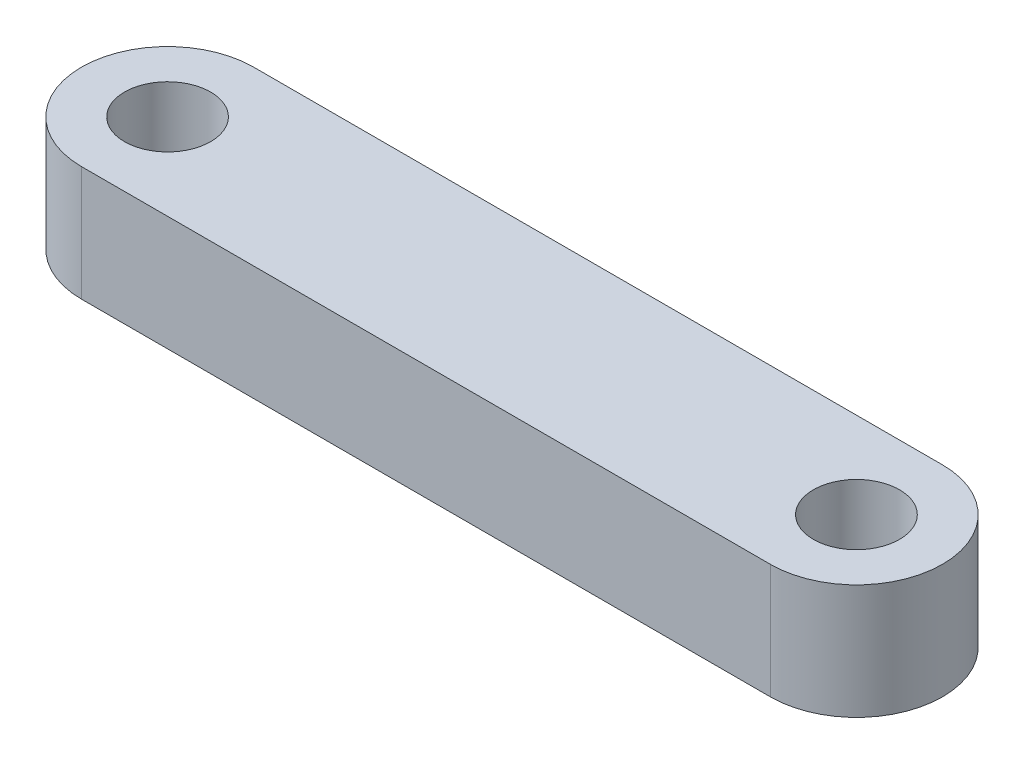
ISO-10303-21;
HEADER;
FILE_DESCRIPTION(('STEP AP214'),'2;1');
FILE_NAME('part.step','',(''),(''),'','','');
FILE_SCHEMA(('AUTOMOTIVE_DESIGN { 1 0 10303 214 1 1 1 1 }'));
ENDSEC;
DATA;
#1=APPLICATION_CONTEXT('core data for automotive mechanical design processes');
#2=APPLICATION_PROTOCOL_DEFINITION('international standard','automotive_design',2000,#1);
#3=PRODUCT_CONTEXT('',#1,'mechanical');
#4=PRODUCT('Part','Part','',(#3));
#5=PRODUCT_RELATED_PRODUCT_CATEGORY('part','',(#4));
#6=PRODUCT_DEFINITION_FORMATION('','',#4);
#7=PRODUCT_DEFINITION_CONTEXT('part definition',#1,'design');
#8=PRODUCT_DEFINITION('design','',#6,#7);
#9=PRODUCT_DEFINITION_SHAPE('','',#8);
#10=(LENGTH_UNIT() NAMED_UNIT(*) SI_UNIT(.MILLI.,.METRE.));
#11=(NAMED_UNIT(*) PLANE_ANGLE_UNIT() SI_UNIT($,.RADIAN.));
#12=(NAMED_UNIT(*) SI_UNIT($,.STERADIAN.) SOLID_ANGLE_UNIT());
#13=UNCERTAINTY_MEASURE_WITH_UNIT(LENGTH_MEASURE(1.E-05),#10,'distance_accuracy_value','');
#14=(GEOMETRIC_REPRESENTATION_CONTEXT(3) GLOBAL_UNCERTAINTY_ASSIGNED_CONTEXT((#13)) GLOBAL_UNIT_ASSIGNED_CONTEXT((#10,
#11,#12)) REPRESENTATION_CONTEXT('',''));
#15=CARTESIAN_POINT('',(0.,0.,0.));
#16=DIRECTION('',(0.,0.,1.));
#17=DIRECTION('',(1.,0.,0.));
#18=AXIS2_PLACEMENT_3D('',#15,#16,#17);
#19=CARTESIAN_POINT('',(0.,4.,0.));
#20=DIRECTION('',(0.,1.,0.));
#21=DIRECTION('',(0.,0.,1.));
#22=AXIS2_PLACEMENT_3D('',#19,#20,#21);
#23=PLANE('',#22);
#24=CARTESIAN_POINT('',(0.,4.,0.));
#25=DIRECTION('',(0.,1.,0.));
#26=DIRECTION('',(0.,0.,1.));
#27=AXIS2_PLACEMENT_3D('',#24,#25,#26);
#28=CIRCLE('',#27,1.5);
#29=CARTESIAN_POINT('',(0.,4.,1.5));
#30=VERTEX_POINT('',#29);
#31=EDGE_CURVE('E108',#30,#30,#28,.T.);
#32=ORIENTED_EDGE('',*,*,#31,.F.);
#33=EDGE_LOOP('',(#32));
#34=FACE_BOUND('',#33,.T.);
#35=CARTESIAN_POINT('',(0.,4.,0.));
#36=DIRECTION('',(0.,1.,0.));
#37=DIRECTION('',(0.,0.,1.));
#38=AXIS2_PLACEMENT_3D('',#35,#36,#37);
#39=CIRCLE('',#38,3.);
#40=CARTESIAN_POINT('',(0.,4.,-3.));
#41=VERTEX_POINT('',#40);
#42=CARTESIAN_POINT('',(0.,4.,3.));
#43=VERTEX_POINT('',#42);
#44=EDGE_CURVE('E93',#41,#43,#39,.T.);
#45=ORIENTED_EDGE('',*,*,#44,.T.);
#46=DIRECTION('',(1.,0.,0.));
#47=VECTOR('',#46,1.);
#48=CARTESIAN_POINT('',(0.,4.,3.));
#49=LINE('',#48,#47);
#50=CARTESIAN_POINT('',(24.,4.,3.));
#51=VERTEX_POINT('',#50);
#52=EDGE_CURVE('E88',#43,#51,#49,.T.);
#53=ORIENTED_EDGE('',*,*,#52,.T.);
#54=CARTESIAN_POINT('',(24.,4.,0.));
#55=DIRECTION('',(0.,1.,0.));
#56=DIRECTION('',(0.,0.,1.));
#57=AXIS2_PLACEMENT_3D('',#54,#55,#56);
#58=CIRCLE('',#57,3.);
#59=CARTESIAN_POINT('',(24.,4.,-3.));
#60=VERTEX_POINT('',#59);
#61=EDGE_CURVE('E91',#51,#60,#58,.T.);
#62=ORIENTED_EDGE('',*,*,#61,.T.);
#63=DIRECTION('',(-1.,0.,0.));
#64=VECTOR('',#63,1.);
#65=CARTESIAN_POINT('',(0.,4.,-3.));
#66=LINE('',#65,#64);
#67=EDGE_CURVE('E58',#60,#41,#66,.T.);
#68=ORIENTED_EDGE('',*,*,#67,.T.);
#69=EDGE_LOOP('',(#45,#53,#62,#68));
#70=FACE_BOUND('',#69,.T.);
#71=CARTESIAN_POINT('',(24.,4.,0.));
#72=DIRECTION('',(0.,1.,0.));
#73=DIRECTION('',(0.,0.,1.));
#74=AXIS2_PLACEMENT_3D('',#71,#72,#73);
#75=CIRCLE('',#74,1.5);
#76=CARTESIAN_POINT('',(24.,4.,1.5));
#77=VERTEX_POINT('',#76);
#78=EDGE_CURVE('E123',#77,#77,#75,.T.);
#79=ORIENTED_EDGE('',*,*,#78,.F.);
#80=EDGE_LOOP('',(#79));
#81=FACE_BOUND('',#80,.T.);
#82=ADVANCED_FACE('F41',(#34,#70,#81),#23,.T.);
#83=CARTESIAN_POINT('',(0.,0.,0.));
#84=DIRECTION('',(0.,1.,0.));
#85=DIRECTION('',(0.,0.,1.));
#86=AXIS2_PLACEMENT_3D('',#83,#84,#85);
#87=PLANE('',#86);
#88=CARTESIAN_POINT('',(0.,0.,0.));
#89=DIRECTION('',(0.,1.,0.));
#90=DIRECTION('',(0.,0.,1.));
#91=AXIS2_PLACEMENT_3D('',#88,#89,#90);
#92=CIRCLE('',#91,3.);
#93=CARTESIAN_POINT('',(0.,0.,-3.));
#94=VERTEX_POINT('',#93);
#95=CARTESIAN_POINT('',(0.,0.,3.));
#96=VERTEX_POINT('',#95);
#97=EDGE_CURVE('E105',#94,#96,#92,.T.);
#98=ORIENTED_EDGE('',*,*,#97,.F.);
#99=DIRECTION('',(-1.,0.,0.));
#100=VECTOR('',#99,1.);
#101=CARTESIAN_POINT('',(0.,0.,-3.));
#102=LINE('',#101,#100);
#103=CARTESIAN_POINT('',(24.,0.,-3.));
#104=VERTEX_POINT('',#103);
#105=EDGE_CURVE('E81',#104,#94,#102,.T.);
#106=ORIENTED_EDGE('',*,*,#105,.F.);
#107=CARTESIAN_POINT('',(24.,0.,0.));
#108=DIRECTION('',(0.,1.,0.));
#109=DIRECTION('',(0.,0.,1.));
#110=AXIS2_PLACEMENT_3D('',#107,#108,#109);
#111=CIRCLE('',#110,3.);
#112=CARTESIAN_POINT('',(24.,0.,3.));
#113=VERTEX_POINT('',#112);
#114=EDGE_CURVE('E75',#113,#104,#111,.T.);
#115=ORIENTED_EDGE('',*,*,#114,.F.);
#116=DIRECTION('',(1.,0.,0.));
#117=VECTOR('',#116,1.);
#118=CARTESIAN_POINT('',(0.,0.,3.));
#119=LINE('',#118,#117);
#120=EDGE_CURVE('E97',#96,#113,#119,.T.);
#121=ORIENTED_EDGE('',*,*,#120,.F.);
#122=EDGE_LOOP('',(#98,#106,#115,#121));
#123=FACE_BOUND('',#122,.T.);
#124=CARTESIAN_POINT('',(0.,0.,0.));
#125=DIRECTION('',(0.,1.,0.));
#126=DIRECTION('',(0.,0.,1.));
#127=AXIS2_PLACEMENT_3D('',#124,#125,#126);
#128=CIRCLE('',#127,1.5);
#129=CARTESIAN_POINT('',(0.,0.,1.5));
#130=VERTEX_POINT('',#129);
#131=EDGE_CURVE('E120',#130,#130,#128,.T.);
#132=ORIENTED_EDGE('',*,*,#131,.T.);
#133=EDGE_LOOP('',(#132));
#134=FACE_BOUND('',#133,.T.);
#135=CARTESIAN_POINT('',(24.,0.,0.));
#136=DIRECTION('',(0.,1.,0.));
#137=DIRECTION('',(0.,0.,1.));
#138=AXIS2_PLACEMENT_3D('',#135,#136,#137);
#139=CIRCLE('',#138,1.5);
#140=CARTESIAN_POINT('',(24.,0.,1.5));
#141=VERTEX_POINT('',#140);
#142=EDGE_CURVE('E126',#141,#141,#139,.T.);
#143=ORIENTED_EDGE('',*,*,#142,.T.);
#144=EDGE_LOOP('',(#143));
#145=FACE_BOUND('',#144,.T.);
#146=ADVANCED_FACE('F116',(#123,#134,#145),#87,.F.);
#147=CARTESIAN_POINT('',(0.,4.,0.));
#148=DIRECTION('',(0.,-1.,0.));
#149=DIRECTION('',(0.,0.,-1.));
#150=AXIS2_PLACEMENT_3D('',#147,#148,#149);
#151=CYLINDRICAL_SURFACE('',#150,3.);
#152=ORIENTED_EDGE('',*,*,#97,.T.);
#153=DIRECTION('',(0.,-1.,0.));
#154=VECTOR('',#153,1.);
#155=CARTESIAN_POINT('',(0.,4.,3.));
#156=LINE('',#155,#154);
#157=EDGE_CURVE('E11',#43,#96,#156,.T.);
#158=ORIENTED_EDGE('',*,*,#157,.F.);
#159=ORIENTED_EDGE('',*,*,#44,.F.);
#160=DIRECTION('',(0.,-1.,0.));
#161=VECTOR('',#160,1.);
#162=CARTESIAN_POINT('',(0.,4.,-3.));
#163=LINE('',#162,#161);
#164=EDGE_CURVE('E101',#41,#94,#163,.T.);
#165=ORIENTED_EDGE('',*,*,#164,.T.);
#166=EDGE_LOOP('',(#152,#158,#159,#165));
#167=FACE_BOUND('',#166,.T.);
#168=ADVANCED_FACE('F43',(#167),#151,.T.);
#169=CARTESIAN_POINT('',(0.,4.,3.));
#170=DIRECTION('',(0.,0.,-1.));
#171=DIRECTION('',(-1.,0.,0.));
#172=AXIS2_PLACEMENT_3D('',#169,#170,#171);
#173=PLANE('',#172);
#174=ORIENTED_EDGE('',*,*,#120,.T.);
#175=DIRECTION('',(0.,-1.,0.));
#176=VECTOR('',#175,1.);
#177=CARTESIAN_POINT('',(24.,4.,3.));
#178=LINE('',#177,#176);
#179=EDGE_CURVE('E50',#51,#113,#178,.T.);
#180=ORIENTED_EDGE('',*,*,#179,.F.);
#181=ORIENTED_EDGE('',*,*,#52,.F.);
#182=ORIENTED_EDGE('',*,*,#157,.T.);
#183=EDGE_LOOP('',(#174,#180,#181,#182));
#184=FACE_BOUND('',#183,.T.);
#185=ADVANCED_FACE('F96',(#184),#173,.F.);
#186=CARTESIAN_POINT('',(24.,4.,0.));
#187=DIRECTION('',(0.,-1.,0.));
#188=DIRECTION('',(0.,0.,-1.));
#189=AXIS2_PLACEMENT_3D('',#186,#187,#188);
#190=CYLINDRICAL_SURFACE('',#189,3.);
#191=ORIENTED_EDGE('',*,*,#114,.T.);
#192=DIRECTION('',(0.,-1.,0.));
#193=VECTOR('',#192,1.);
#194=CARTESIAN_POINT('',(24.,4.,-3.));
#195=LINE('',#194,#193);
#196=EDGE_CURVE('E98',#60,#104,#195,.T.);
#197=ORIENTED_EDGE('',*,*,#196,.F.);
#198=ORIENTED_EDGE('',*,*,#61,.F.);
#199=ORIENTED_EDGE('',*,*,#179,.T.);
#200=EDGE_LOOP('',(#191,#197,#198,#199));
#201=FACE_BOUND('',#200,.T.);
#202=ADVANCED_FACE('F99',(#201),#190,.T.);
#203=CARTESIAN_POINT('',(0.,4.,-3.));
#204=DIRECTION('',(0.,0.,1.));
#205=DIRECTION('',(1.,0.,0.));
#206=AXIS2_PLACEMENT_3D('',#203,#204,#205);
#207=PLANE('',#206);
#208=ORIENTED_EDGE('',*,*,#105,.T.);
#209=ORIENTED_EDGE('',*,*,#164,.F.);
#210=ORIENTED_EDGE('',*,*,#67,.F.);
#211=ORIENTED_EDGE('',*,*,#196,.T.);
#212=EDGE_LOOP('',(#208,#209,#210,#211));
#213=FACE_BOUND('',#212,.T.);
#214=ADVANCED_FACE('F113',(#213),#207,.F.);
#215=CARTESIAN_POINT('',(0.,4.,0.));
#216=DIRECTION('',(0.,-1.,0.));
#217=DIRECTION('',(0.,0.,-1.));
#218=AXIS2_PLACEMENT_3D('',#215,#216,#217);
#219=CYLINDRICAL_SURFACE('',#218,1.5);
#220=ORIENTED_EDGE('',*,*,#31,.T.);
#221=EDGE_LOOP('',(#220));
#222=FACE_BOUND('',#221,.T.);
#223=ORIENTED_EDGE('',*,*,#131,.F.);
#224=EDGE_LOOP('',(#223));
#225=FACE_BOUND('',#224,.T.);
#226=ADVANCED_FACE('F143',(#222,#225),#219,.F.);
#227=CARTESIAN_POINT('',(24.,4.,0.));
#228=DIRECTION('',(0.,-1.,0.));
#229=DIRECTION('',(0.,0.,-1.));
#230=AXIS2_PLACEMENT_3D('',#227,#228,#229);
#231=CYLINDRICAL_SURFACE('',#230,1.5);
#232=ORIENTED_EDGE('',*,*,#78,.T.);
#233=EDGE_LOOP('',(#232));
#234=FACE_BOUND('',#233,.T.);
#235=ORIENTED_EDGE('',*,*,#142,.F.);
#236=EDGE_LOOP('',(#235));
#237=FACE_BOUND('',#236,.T.);
#238=ADVANCED_FACE('F132',(#234,#237),#231,.F.);
#239=CLOSED_SHELL('',(#82,#146,#168,#185,#202,#214,#226,#238));
#240=MANIFOLD_SOLID_BREP('B2',#239);
#241=ADVANCED_BREP_SHAPE_REPRESENTATION('',(#18,#240),#14);
#242=SHAPE_DEFINITION_REPRESENTATION(#9,#241);
ENDSEC;
END-ISO-10303-21;
